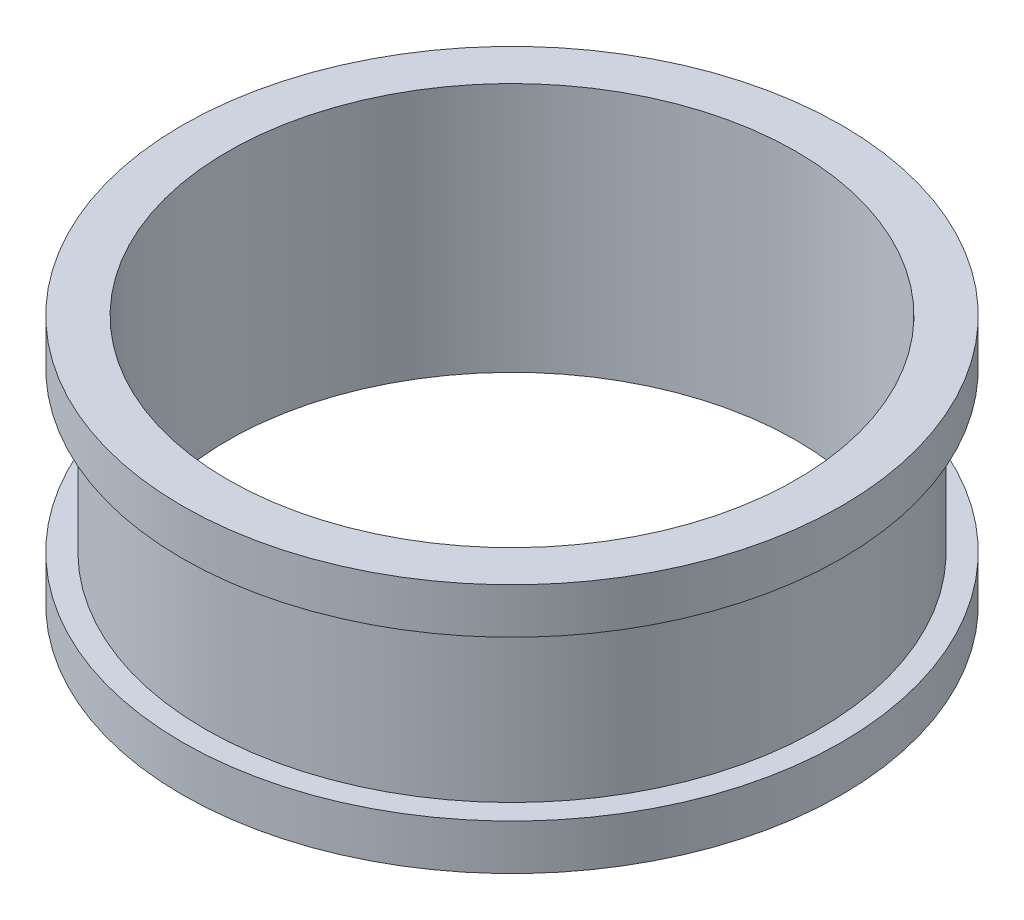
ISO-10303-21;
HEADER;
FILE_DESCRIPTION(('STEP AP214'),'2;1');
FILE_NAME('part.step','',(''),(''),'','','');
FILE_SCHEMA(('AUTOMOTIVE_DESIGN { 1 0 10303 214 1 1 1 1 }'));
ENDSEC;
DATA;
#1=APPLICATION_CONTEXT('core data for automotive mechanical design processes');
#2=APPLICATION_PROTOCOL_DEFINITION('international standard','automotive_design',2000,#1);
#3=PRODUCT_CONTEXT('',#1,'mechanical');
#4=PRODUCT('Part','Part','',(#3));
#5=PRODUCT_RELATED_PRODUCT_CATEGORY('part','',(#4));
#6=PRODUCT_DEFINITION_FORMATION('','',#4);
#7=PRODUCT_DEFINITION_CONTEXT('part definition',#1,'design');
#8=PRODUCT_DEFINITION('design','',#6,#7);
#9=PRODUCT_DEFINITION_SHAPE('','',#8);
#10=(LENGTH_UNIT() NAMED_UNIT(*) SI_UNIT(.MILLI.,.METRE.));
#11=(NAMED_UNIT(*) PLANE_ANGLE_UNIT() SI_UNIT($,.RADIAN.));
#12=(NAMED_UNIT(*) SI_UNIT($,.STERADIAN.) SOLID_ANGLE_UNIT());
#13=UNCERTAINTY_MEASURE_WITH_UNIT(LENGTH_MEASURE(1.E-05),#10,'distance_accuracy_value','');
#14=(GEOMETRIC_REPRESENTATION_CONTEXT(3) GLOBAL_UNCERTAINTY_ASSIGNED_CONTEXT((#13)) GLOBAL_UNIT_ASSIGNED_CONTEXT((#10,
#11,#12)) REPRESENTATION_CONTEXT('',''));
#15=CARTESIAN_POINT('',(0.,0.,0.));
#16=DIRECTION('',(0.,0.,1.));
#17=DIRECTION('',(1.,0.,0.));
#18=AXIS2_PLACEMENT_3D('',#15,#16,#17);
#19=CARTESIAN_POINT('',(0.,11.,0.));
#20=DIRECTION('',(0.,-1.,0.));
#21=DIRECTION('',(0.,0.,-1.));
#22=AXIS2_PLACEMENT_3D('',#19,#20,#21);
#23=CYLINDRICAL_SURFACE('',#22,14.5);
#24=CARTESIAN_POINT('',(0.,9.,0.));
#25=DIRECTION('',(0.,1.,0.));
#26=DIRECTION('',(0.,0.,1.));
#27=AXIS2_PLACEMENT_3D('',#24,#25,#26);
#28=CIRCLE('',#27,14.5);
#29=CARTESIAN_POINT('',(0.,9.,14.5));
#30=VERTEX_POINT('',#29);
#31=EDGE_CURVE('E47',#30,#30,#28,.T.);
#32=ORIENTED_EDGE('',*,*,#31,.T.);
#33=EDGE_LOOP('',(#32));
#34=FACE_BOUND('',#33,.T.);
#35=CARTESIAN_POINT('',(0.,11.,0.));
#36=DIRECTION('',(0.,1.,0.));
#37=DIRECTION('',(0.,0.,1.));
#38=AXIS2_PLACEMENT_3D('',#35,#36,#37);
#39=CIRCLE('',#38,14.5);
#40=CARTESIAN_POINT('',(0.,11.,14.5));
#41=VERTEX_POINT('',#40);
#42=EDGE_CURVE('E10',#41,#41,#39,.T.);
#43=ORIENTED_EDGE('',*,*,#42,.F.);
#44=EDGE_LOOP('',(#43));
#45=FACE_BOUND('',#44,.T.);
#46=ADVANCED_FACE('F31',(#34,#45),#23,.T.);
#47=CARTESIAN_POINT('',(0.,2.,0.));
#48=DIRECTION('',(0.,1.,0.));
#49=DIRECTION('',(0.,0.,1.));
#50=AXIS2_PLACEMENT_3D('',#47,#48,#49);
#51=CIRCLE('',#50,14.5);
#52=CARTESIAN_POINT('',(0.,2.,14.5));
#53=VERTEX_POINT('',#52);
#54=EDGE_CURVE('E58',#53,#53,#51,.T.);
#55=ORIENTED_EDGE('',*,*,#54,.F.);
#56=EDGE_LOOP('',(#55));
#57=FACE_BOUND('',#56,.T.);
#58=CARTESIAN_POINT('',(0.,0.,0.));
#59=DIRECTION('',(0.,1.,0.));
#60=DIRECTION('',(0.,0.,1.));
#61=AXIS2_PLACEMENT_3D('',#58,#59,#60);
#62=CIRCLE('',#61,14.5);
#63=CARTESIAN_POINT('',(0.,0.,14.5));
#64=VERTEX_POINT('',#63);
#65=EDGE_CURVE('E35',#64,#64,#62,.T.);
#66=ORIENTED_EDGE('',*,*,#65,.T.);
#67=EDGE_LOOP('',(#66));
#68=FACE_BOUND('',#67,.T.);
#69=ADVANCED_FACE('F33',(#57,#68),#23,.T.);
#70=CARTESIAN_POINT('',(0.,11.,0.));
#71=DIRECTION('',(0.,1.,0.));
#72=DIRECTION('',(0.,0.,1.));
#73=AXIS2_PLACEMENT_3D('',#70,#71,#72);
#74=PLANE('',#73);
#75=CARTESIAN_POINT('',(0.,11.,0.));
#76=DIRECTION('',(0.,-1.,0.));
#77=DIRECTION('',(0.,0.,-1.));
#78=AXIS2_PLACEMENT_3D('',#75,#76,#77);
#79=CIRCLE('',#78,12.5);
#80=CARTESIAN_POINT('',(0.,11.,-12.5));
#81=VERTEX_POINT('',#80);
#82=EDGE_CURVE('E42',#81,#81,#79,.T.);
#83=ORIENTED_EDGE('',*,*,#82,.T.);
#84=EDGE_LOOP('',(#83));
#85=FACE_BOUND('',#84,.T.);
#86=ORIENTED_EDGE('',*,*,#42,.T.);
#87=EDGE_LOOP('',(#86));
#88=FACE_BOUND('',#87,.T.);
#89=ADVANCED_FACE('F66',(#85,#88),#74,.T.);
#90=CARTESIAN_POINT('',(0.,0.,0.));
#91=DIRECTION('',(0.,1.,0.));
#92=DIRECTION('',(0.,0.,1.));
#93=AXIS2_PLACEMENT_3D('',#90,#91,#92);
#94=PLANE('',#93);
#95=CARTESIAN_POINT('',(0.,0.,0.));
#96=DIRECTION('',(0.,-1.,0.));
#97=DIRECTION('',(0.,0.,-1.));
#98=AXIS2_PLACEMENT_3D('',#95,#96,#97);
#99=CIRCLE('',#98,12.5);
#100=CARTESIAN_POINT('',(0.,0.,-12.5));
#101=VERTEX_POINT('',#100);
#102=EDGE_CURVE('E44',#101,#101,#99,.T.);
#103=ORIENTED_EDGE('',*,*,#102,.F.);
#104=EDGE_LOOP('',(#103));
#105=FACE_BOUND('',#104,.T.);
#106=ORIENTED_EDGE('',*,*,#65,.F.);
#107=EDGE_LOOP('',(#106));
#108=FACE_BOUND('',#107,.T.);
#109=ADVANCED_FACE('F69',(#105,#108),#94,.F.);
#110=CARTESIAN_POINT('',(0.,11.,0.));
#111=DIRECTION('',(0.,-1.,0.));
#112=DIRECTION('',(0.,0.,-1.));
#113=AXIS2_PLACEMENT_3D('',#110,#111,#112);
#114=CYLINDRICAL_SURFACE('',#113,12.5);
#115=ORIENTED_EDGE('',*,*,#82,.F.);
#116=EDGE_LOOP('',(#115));
#117=FACE_BOUND('',#116,.T.);
#118=ORIENTED_EDGE('',*,*,#102,.T.);
#119=EDGE_LOOP('',(#118));
#120=FACE_BOUND('',#119,.T.);
#121=ADVANCED_FACE('F71',(#117,#120),#114,.F.);
#122=CARTESIAN_POINT('',(0.,9.,14.5));
#123=DIRECTION('',(0.,1.,0.));
#124=DIRECTION('',(0.,0.,1.));
#125=AXIS2_PLACEMENT_3D('',#122,#123,#124);
#126=PLANE('',#125);
#127=ORIENTED_EDGE('',*,*,#31,.F.);
#128=EDGE_LOOP('',(#127));
#129=FACE_BOUND('',#128,.T.);
#130=CARTESIAN_POINT('',(0.,9.,0.));
#131=DIRECTION('',(0.,1.,0.));
#132=DIRECTION('',(0.,0.,1.));
#133=AXIS2_PLACEMENT_3D('',#130,#131,#132);
#134=CIRCLE('',#133,13.5);
#135=CARTESIAN_POINT('',(0.,9.,13.5));
#136=VERTEX_POINT('',#135);
#137=EDGE_CURVE('E52',#136,#136,#134,.T.);
#138=ORIENTED_EDGE('',*,*,#137,.T.);
#139=EDGE_LOOP('',(#138));
#140=FACE_BOUND('',#139,.T.);
#141=ADVANCED_FACE('F77',(#129,#140),#126,.F.);
#142=CARTESIAN_POINT('',(0.,11.640939064954,0.));
#143=DIRECTION('',(0.,1.,0.));
#144=DIRECTION('',(0.,0.,1.));
#145=AXIS2_PLACEMENT_3D('',#142,#143,#144);
#146=CYLINDRICAL_SURFACE('',#145,13.5);
#147=ORIENTED_EDGE('',*,*,#137,.F.);
#148=EDGE_LOOP('',(#147));
#149=FACE_BOUND('',#148,.T.);
#150=CARTESIAN_POINT('',(0.,2.,0.));
#151=DIRECTION('',(0.,1.,0.));
#152=DIRECTION('',(0.,0.,1.));
#153=AXIS2_PLACEMENT_3D('',#150,#151,#152);
#154=CIRCLE('',#153,13.5);
#155=CARTESIAN_POINT('',(0.,2.,13.5));
#156=VERTEX_POINT('',#155);
#157=EDGE_CURVE('E55',#156,#156,#154,.T.);
#158=ORIENTED_EDGE('',*,*,#157,.T.);
#159=EDGE_LOOP('',(#158));
#160=FACE_BOUND('',#159,.T.);
#161=ADVANCED_FACE('F92',(#149,#160),#146,.T.);
#162=CARTESIAN_POINT('',(0.,2.,13.5));
#163=DIRECTION('',(0.,-1.,0.));
#164=DIRECTION('',(0.,0.,-1.));
#165=AXIS2_PLACEMENT_3D('',#162,#163,#164);
#166=PLANE('',#165);
#167=ORIENTED_EDGE('',*,*,#157,.F.);
#168=EDGE_LOOP('',(#167));
#169=FACE_BOUND('',#168,.T.);
#170=ORIENTED_EDGE('',*,*,#54,.T.);
#171=EDGE_LOOP('',(#170));
#172=FACE_BOUND('',#171,.T.);
#173=ADVANCED_FACE('F62',(#169,#172),#166,.F.);
#174=CLOSED_SHELL('',(#46,#69,#89,#109,#121,#141,#161,#173));
#175=MANIFOLD_SOLID_BREP('B2',#174);
#176=ADVANCED_BREP_SHAPE_REPRESENTATION('',(#18,#175),#14);
#177=SHAPE_DEFINITION_REPRESENTATION(#9,#176);
ENDSEC;
END-ISO-10303-21;
